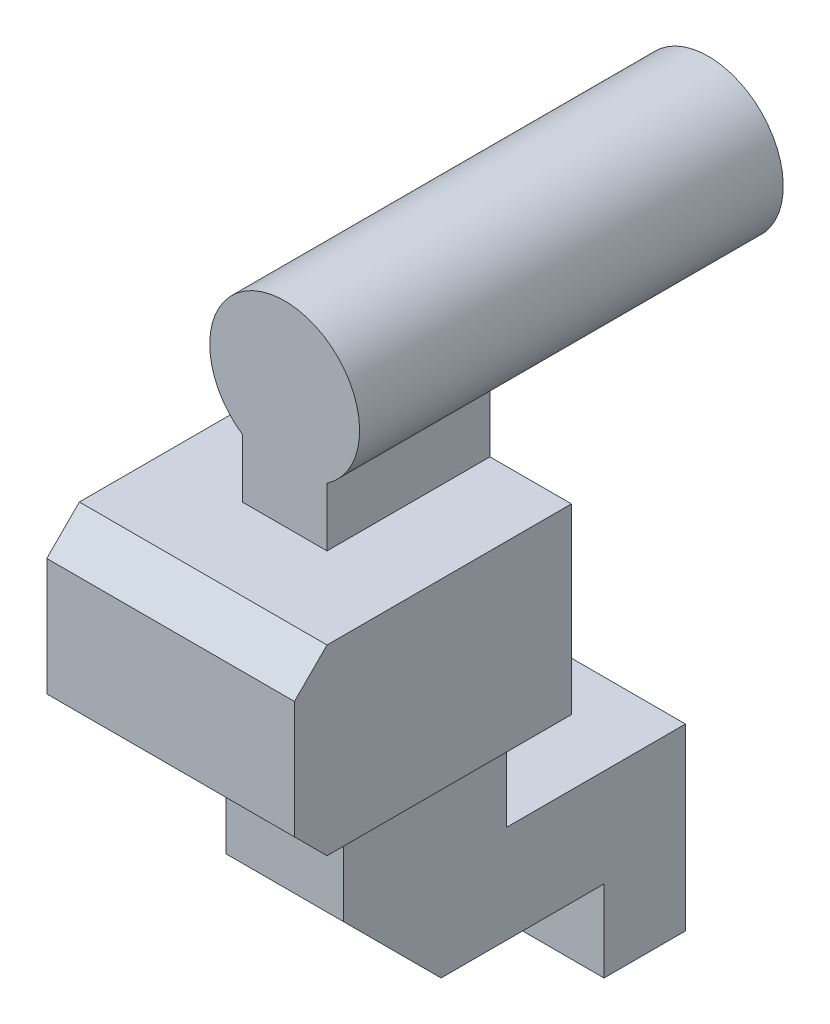
ISO-10303-21;
HEADER;
FILE_DESCRIPTION(('STEP AP214'),'2;1');
FILE_NAME('part.step','',(''),(''),'','','');
FILE_SCHEMA(('AUTOMOTIVE_DESIGN { 1 0 10303 214 1 1 1 1 }'));
ENDSEC;
DATA;
#1=APPLICATION_CONTEXT('core data for automotive mechanical design processes');
#2=APPLICATION_PROTOCOL_DEFINITION('international standard','automotive_design',2000,#1);
#3=PRODUCT_CONTEXT('',#1,'mechanical');
#4=PRODUCT('Part','Part','',(#3));
#5=PRODUCT_RELATED_PRODUCT_CATEGORY('part','',(#4));
#6=PRODUCT_DEFINITION_FORMATION('','',#4);
#7=PRODUCT_DEFINITION_CONTEXT('part definition',#1,'design');
#8=PRODUCT_DEFINITION('design','',#6,#7);
#9=PRODUCT_DEFINITION_SHAPE('','',#8);
#10=(LENGTH_UNIT() NAMED_UNIT(*) SI_UNIT(.MILLI.,.METRE.));
#11=(NAMED_UNIT(*) PLANE_ANGLE_UNIT() SI_UNIT($,.RADIAN.));
#12=(NAMED_UNIT(*) SI_UNIT($,.STERADIAN.) SOLID_ANGLE_UNIT());
#13=UNCERTAINTY_MEASURE_WITH_UNIT(LENGTH_MEASURE(1.E-05),#10,'distance_accuracy_value','');
#14=(GEOMETRIC_REPRESENTATION_CONTEXT(3) GLOBAL_UNCERTAINTY_ASSIGNED_CONTEXT((#13)) GLOBAL_UNIT_ASSIGNED_CONTEXT((#10,
#11,#12)) REPRESENTATION_CONTEXT('',''));
#15=CARTESIAN_POINT('',(0.,0.,0.));
#16=DIRECTION('',(0.,0.,1.));
#17=DIRECTION('',(1.,0.,0.));
#18=AXIS2_PLACEMENT_3D('',#15,#16,#17);
#19=CARTESIAN_POINT('',(0.,0.,5.));
#20=DIRECTION('',(0.,0.,1.));
#21=DIRECTION('',(1.,0.,0.));
#22=AXIS2_PLACEMENT_3D('',#19,#20,#21);
#23=PLANE('',#22);
#24=DIRECTION('',(0.,1.,0.));
#25=VECTOR('',#24,1.);
#26=CARTESIAN_POINT('',(-1.3,0.,5.));
#27=LINE('',#26,#25);
#28=CARTESIAN_POINT('',(-1.3,2.8,5.));
#29=VERTEX_POINT('',#28);
#30=CARTESIAN_POINT('',(-1.3,4.6,5.));
#31=VERTEX_POINT('',#30);
#32=EDGE_CURVE('E248',#29,#31,#27,.T.);
#33=ORIENTED_EDGE('',*,*,#32,.F.);
#34=DIRECTION('',(1.,0.,0.));
#35=VECTOR('',#34,1.);
#36=CARTESIAN_POINT('',(-3.8,2.8,5.));
#37=LINE('',#36,#35);
#38=CARTESIAN_POINT('',(1.3,2.8,5.));
#39=VERTEX_POINT('',#38);
#40=EDGE_CURVE('E306',#29,#39,#37,.T.);
#41=ORIENTED_EDGE('',*,*,#40,.T.);
#42=DIRECTION('',(0.,1.,0.));
#43=VECTOR('',#42,1.);
#44=CARTESIAN_POINT('',(1.3,0.,5.));
#45=LINE('',#44,#43);
#46=CARTESIAN_POINT('',(1.3,4.6,5.));
#47=VERTEX_POINT('',#46);
#48=EDGE_CURVE('E267',#39,#47,#45,.T.);
#49=ORIENTED_EDGE('',*,*,#48,.T.);
#50=CARTESIAN_POINT('',(0.,6.49736659610103,5.));
#51=DIRECTION('',(0.,0.,1.));
#52=DIRECTION('',(1.,0.,0.));
#53=AXIS2_PLACEMENT_3D('',#50,#51,#52);
#54=CIRCLE('',#53,2.3);
#55=EDGE_CURVE('E254',#47,#31,#54,.T.);
#56=ORIENTED_EDGE('',*,*,#55,.T.);
#57=EDGE_LOOP('',(#33,#41,#49,#56));
#58=FACE_BOUND('',#57,.T.);
#59=ADVANCED_FACE('F67',(#58),#23,.T.);
#60=CARTESIAN_POINT('',(0.,0.,0.));
#61=DIRECTION('',(0.,0.,1.));
#62=DIRECTION('',(1.,0.,0.));
#63=AXIS2_PLACEMENT_3D('',#60,#61,#62);
#64=PLANE('',#63);
#65=DIRECTION('',(0.,1.,0.));
#66=VECTOR('',#65,1.);
#67=CARTESIAN_POINT('',(1.8,-9.8,0.));
#68=LINE('',#67,#66);
#69=CARTESIAN_POINT('',(1.8,-6.8,0.));
#70=VERTEX_POINT('',#69);
#71=CARTESIAN_POINT('',(1.8,-2.8,0.));
#72=VERTEX_POINT('',#71);
#73=EDGE_CURVE('E219',#70,#72,#68,.T.);
#74=ORIENTED_EDGE('',*,*,#73,.F.);
#75=DIRECTION('',(-1.,0.,0.));
#76=VECTOR('',#75,1.);
#77=CARTESIAN_POINT('',(1.8,-6.8,0.));
#78=LINE('',#77,#76);
#79=CARTESIAN_POINT('',(-1.8,-6.8,0.));
#80=VERTEX_POINT('',#79);
#81=EDGE_CURVE('E201',#70,#80,#78,.T.);
#82=ORIENTED_EDGE('',*,*,#81,.T.);
#83=DIRECTION('',(0.,-1.,0.));
#84=VECTOR('',#83,1.);
#85=CARTESIAN_POINT('',(-1.8,-2.8,0.));
#86=LINE('',#85,#84);
#87=CARTESIAN_POINT('',(-1.8,-2.8,0.));
#88=VERTEX_POINT('',#87);
#89=EDGE_CURVE('E232',#88,#80,#86,.T.);
#90=ORIENTED_EDGE('',*,*,#89,.F.);
#91=DIRECTION('',(1.,0.,0.));
#92=VECTOR('',#91,1.);
#93=CARTESIAN_POINT('',(-3.8,-2.8,0.));
#94=LINE('',#93,#92);
#95=CARTESIAN_POINT('',(-3.8,-2.8,0.));
#96=VERTEX_POINT('',#95);
#97=EDGE_CURVE('E286',#96,#88,#94,.T.);
#98=ORIENTED_EDGE('',*,*,#97,.F.);
#99=DIRECTION('',(0.,-1.,0.));
#100=VECTOR('',#99,1.);
#101=CARTESIAN_POINT('',(-3.8,2.8,0.));
#102=LINE('',#101,#100);
#103=CARTESIAN_POINT('',(-3.8,2.8,0.));
#104=VERTEX_POINT('',#103);
#105=EDGE_CURVE('E283',#104,#96,#102,.T.);
#106=ORIENTED_EDGE('',*,*,#105,.F.);
#107=DIRECTION('',(-1.,0.,0.));
#108=VECTOR('',#107,1.);
#109=CARTESIAN_POINT('',(-3.8,2.8,0.));
#110=LINE('',#109,#108);
#111=CARTESIAN_POINT('',(-1.3,2.8,0.));
#112=VERTEX_POINT('',#111);
#113=EDGE_CURVE('E279',#112,#104,#110,.T.);
#114=ORIENTED_EDGE('',*,*,#113,.F.);
#115=DIRECTION('',(0.,1.,0.));
#116=VECTOR('',#115,1.);
#117=CARTESIAN_POINT('',(-1.3,0.,0.));
#118=LINE('',#117,#116);
#119=CARTESIAN_POINT('',(-1.3,4.6,0.));
#120=VERTEX_POINT('',#119);
#121=EDGE_CURVE('E263',#112,#120,#118,.T.);
#122=ORIENTED_EDGE('',*,*,#121,.T.);
#123=CARTESIAN_POINT('',(0.,6.49736659610103,0.));
#124=DIRECTION('',(0.,0.,-1.));
#125=DIRECTION('',(-1.,0.,0.));
#126=AXIS2_PLACEMENT_3D('',#123,#124,#125);
#127=CIRCLE('',#126,2.3);
#128=CARTESIAN_POINT('',(1.3,4.6,0.));
#129=VERTEX_POINT('',#128);
#130=EDGE_CURVE('E329',#129,#120,#127,.T.);
#131=ORIENTED_EDGE('',*,*,#130,.F.);
#132=DIRECTION('',(0.,1.,0.));
#133=VECTOR('',#132,1.);
#134=CARTESIAN_POINT('',(1.3,0.,0.));
#135=LINE('',#134,#133);
#136=CARTESIAN_POINT('',(1.3,2.8,0.));
#137=VERTEX_POINT('',#136);
#138=EDGE_CURVE('E266',#137,#129,#135,.T.);
#139=ORIENTED_EDGE('',*,*,#138,.F.);
#140=CARTESIAN_POINT('',(3.8,2.8,0.));
#141=VERTEX_POINT('',#140);
#142=EDGE_CURVE('E280',#141,#137,#110,.T.);
#143=ORIENTED_EDGE('',*,*,#142,.F.);
#144=DIRECTION('',(0.,1.,0.));
#145=VECTOR('',#144,1.);
#146=CARTESIAN_POINT('',(3.8,2.8,0.));
#147=LINE('',#146,#145);
#148=CARTESIAN_POINT('',(3.8,-2.8,0.));
#149=VERTEX_POINT('',#148);
#150=EDGE_CURVE('E261',#149,#141,#147,.T.);
#151=ORIENTED_EDGE('',*,*,#150,.F.);
#152=EDGE_CURVE('E230',#72,#149,#94,.T.);
#153=ORIENTED_EDGE('',*,*,#152,.F.);
#154=EDGE_LOOP('',(#74,#82,#90,#98,#106,#114,#122,#131,#139,#143,#151,#153));
#155=FACE_BOUND('',#154,.T.);
#156=ADVANCED_FACE('F227',(#155),#64,.F.);
#157=CARTESIAN_POINT('',(3.8,2.8,5.));
#158=DIRECTION('',(-1.,0.,0.));
#159=DIRECTION('',(0.,-1.,0.));
#160=AXIS2_PLACEMENT_3D('',#157,#158,#159);
#161=PLANE('',#160);
#162=DIRECTION('',(0.,-1.,0.));
#163=VECTOR('',#162,1.);
#164=CARTESIAN_POINT('',(3.8,2.8,8.5));
#165=LINE('',#164,#163);
#166=CARTESIAN_POINT('',(3.8,1.79999999999999,8.5));
#167=VERTEX_POINT('',#166);
#168=CARTESIAN_POINT('',(3.8,-1.8,8.5));
#169=VERTEX_POINT('',#168);
#170=EDGE_CURVE('E330',#167,#169,#165,.T.);
#171=ORIENTED_EDGE('',*,*,#170,.T.);
#172=DIRECTION('',(0.,-0.707106781186545,-0.70710678118655));
#173=VECTOR('',#172,1.);
#174=CARTESIAN_POINT('',(3.8,-1.8,8.5));
#175=LINE('',#174,#173);
#176=CARTESIAN_POINT('',(3.8,-2.8,7.49999999999999));
#177=VERTEX_POINT('',#176);
#178=EDGE_CURVE('E315',#169,#177,#175,.T.);
#179=ORIENTED_EDGE('',*,*,#178,.T.);
#180=DIRECTION('',(0.,0.,-1.));
#181=VECTOR('',#180,1.);
#182=CARTESIAN_POINT('',(3.8,-2.8,5.));
#183=LINE('',#182,#181);
#184=EDGE_CURVE('E289',#177,#149,#183,.T.);
#185=ORIENTED_EDGE('',*,*,#184,.T.);
#186=ORIENTED_EDGE('',*,*,#150,.T.);
#187=DIRECTION('',(0.,0.,-1.));
#188=VECTOR('',#187,1.);
#189=CARTESIAN_POINT('',(3.8,2.8,5.));
#190=LINE('',#189,#188);
#191=CARTESIAN_POINT('',(3.8,2.8,7.5));
#192=VERTEX_POINT('',#191);
#193=EDGE_CURVE('E295',#192,#141,#190,.T.);
#194=ORIENTED_EDGE('',*,*,#193,.F.);
#195=DIRECTION('',(0.,-0.70710678118655,0.707106781186545));
#196=VECTOR('',#195,1.);
#197=CARTESIAN_POINT('',(3.8,2.8,7.5));
#198=LINE('',#197,#196);
#199=EDGE_CURVE('E313',#192,#167,#198,.T.);
#200=ORIENTED_EDGE('',*,*,#199,.T.);
#201=EDGE_LOOP('',(#171,#179,#185,#186,#194,#200));
#202=FACE_BOUND('',#201,.T.);
#203=ADVANCED_FACE('F334',(#202),#161,.F.);
#204=CARTESIAN_POINT('',(-3.8,2.8,5.));
#205=DIRECTION('',(0.,-1.,0.));
#206=DIRECTION('',(0.,0.,-1.));
#207=AXIS2_PLACEMENT_3D('',#204,#205,#206);
#208=PLANE('',#207);
#209=DIRECTION('',(0.,0.,-1.));
#210=VECTOR('',#209,1.);
#211=CARTESIAN_POINT('',(-3.8,2.8,5.));
#212=LINE('',#211,#210);
#213=CARTESIAN_POINT('',(-3.8,2.8,7.5));
#214=VERTEX_POINT('',#213);
#215=EDGE_CURVE('E293',#214,#104,#212,.T.);
#216=ORIENTED_EDGE('',*,*,#215,.F.);
#217=DIRECTION('',(1.,0.,0.));
#218=VECTOR('',#217,1.);
#219=CARTESIAN_POINT('',(3.8,2.8,7.5));
#220=LINE('',#219,#218);
#221=EDGE_CURVE('E12',#214,#192,#220,.T.);
#222=ORIENTED_EDGE('',*,*,#221,.T.);
#223=ORIENTED_EDGE('',*,*,#193,.T.);
#224=ORIENTED_EDGE('',*,*,#142,.T.);
#225=DIRECTION('',(0.,0.,1.));
#226=VECTOR('',#225,1.);
#227=CARTESIAN_POINT('',(1.3,2.8,0.));
#228=LINE('',#227,#226);
#229=EDGE_CURVE('E258',#137,#39,#228,.T.);
#230=ORIENTED_EDGE('',*,*,#229,.T.);
#231=ORIENTED_EDGE('',*,*,#40,.F.);
#232=DIRECTION('',(0.,0.,1.));
#233=VECTOR('',#232,1.);
#234=CARTESIAN_POINT('',(-1.3,2.8,0.));
#235=LINE('',#234,#233);
#236=EDGE_CURVE('E270',#112,#29,#235,.T.);
#237=ORIENTED_EDGE('',*,*,#236,.F.);
#238=ORIENTED_EDGE('',*,*,#113,.T.);
#239=EDGE_LOOP('',(#216,#222,#223,#224,#230,#231,#237,#238));
#240=FACE_BOUND('',#239,.T.);
#241=ADVANCED_FACE('F341',(#240),#208,.F.);
#242=CARTESIAN_POINT('',(-3.8,2.8,5.));
#243=DIRECTION('',(1.,0.,0.));
#244=DIRECTION('',(0.,1.,0.));
#245=AXIS2_PLACEMENT_3D('',#242,#243,#244);
#246=PLANE('',#245);
#247=DIRECTION('',(0.,0.,-1.));
#248=VECTOR('',#247,1.);
#249=CARTESIAN_POINT('',(-3.8,-2.8,5.));
#250=LINE('',#249,#248);
#251=CARTESIAN_POINT('',(-3.8,-2.8,7.49999999999999));
#252=VERTEX_POINT('',#251);
#253=EDGE_CURVE('E291',#252,#96,#250,.T.);
#254=ORIENTED_EDGE('',*,*,#253,.F.);
#255=DIRECTION('',(0.,0.707106781186545,0.70710678118655));
#256=VECTOR('',#255,1.);
#257=CARTESIAN_POINT('',(-3.8,-1.8,8.5));
#258=LINE('',#257,#256);
#259=CARTESIAN_POINT('',(-3.8,-1.8,8.5));
#260=VERTEX_POINT('',#259);
#261=EDGE_CURVE('E76',#252,#260,#258,.T.);
#262=ORIENTED_EDGE('',*,*,#261,.T.);
#263=DIRECTION('',(0.,-1.,0.));
#264=VECTOR('',#263,1.);
#265=CARTESIAN_POINT('',(-3.8,2.8,8.5));
#266=LINE('',#265,#264);
#267=CARTESIAN_POINT('',(-3.8,1.79999999999999,8.5));
#268=VERTEX_POINT('',#267);
#269=EDGE_CURVE('E321',#268,#260,#266,.T.);
#270=ORIENTED_EDGE('',*,*,#269,.F.);
#271=DIRECTION('',(0.,0.70710678118655,-0.707106781186545));
#272=VECTOR('',#271,1.);
#273=CARTESIAN_POINT('',(-3.8,2.8,7.5));
#274=LINE('',#273,#272);
#275=EDGE_CURVE('E83',#268,#214,#274,.T.);
#276=ORIENTED_EDGE('',*,*,#275,.T.);
#277=ORIENTED_EDGE('',*,*,#215,.T.);
#278=ORIENTED_EDGE('',*,*,#105,.T.);
#279=EDGE_LOOP('',(#254,#262,#270,#276,#277,#278));
#280=FACE_BOUND('',#279,.T.);
#281=ADVANCED_FACE('F320',(#280),#246,.F.);
#282=CARTESIAN_POINT('',(-3.8,-2.8,5.));
#283=DIRECTION('',(0.,1.,0.));
#284=DIRECTION('',(0.,0.,1.));
#285=AXIS2_PLACEMENT_3D('',#282,#283,#284);
#286=PLANE('',#285);
#287=ORIENTED_EDGE('',*,*,#184,.F.);
#288=DIRECTION('',(-1.,0.,0.));
#289=VECTOR('',#288,1.);
#290=CARTESIAN_POINT('',(-3.8,-2.8,7.49999999999999));
#291=LINE('',#290,#289);
#292=EDGE_CURVE('E91',#177,#252,#291,.T.);
#293=ORIENTED_EDGE('',*,*,#292,.T.);
#294=ORIENTED_EDGE('',*,*,#253,.T.);
#295=ORIENTED_EDGE('',*,*,#97,.T.);
#296=DIRECTION('',(0.,0.,1.));
#297=VECTOR('',#296,1.);
#298=CARTESIAN_POINT('',(-1.8,-2.8,0.));
#299=LINE('',#298,#297);
#300=CARTESIAN_POINT('',(-1.8,-2.8,5.));
#301=VERTEX_POINT('',#300);
#302=EDGE_CURVE('E231',#88,#301,#299,.T.);
#303=ORIENTED_EDGE('',*,*,#302,.T.);
#304=DIRECTION('',(1.,0.,0.));
#305=VECTOR('',#304,1.);
#306=CARTESIAN_POINT('',(-3.8,-2.8,5.));
#307=LINE('',#306,#305);
#308=CARTESIAN_POINT('',(1.8,-2.8,5.));
#309=VERTEX_POINT('',#308);
#310=EDGE_CURVE('E310',#301,#309,#307,.T.);
#311=ORIENTED_EDGE('',*,*,#310,.T.);
#312=DIRECTION('',(0.,0.,1.));
#313=VECTOR('',#312,1.);
#314=CARTESIAN_POINT('',(1.8,-2.8,0.));
#315=LINE('',#314,#313);
#316=EDGE_CURVE('E246',#72,#309,#315,.T.);
#317=ORIENTED_EDGE('',*,*,#316,.F.);
#318=ORIENTED_EDGE('',*,*,#152,.T.);
#319=EDGE_LOOP('',(#287,#293,#294,#295,#303,#311,#317,#318));
#320=FACE_BOUND('',#319,.T.);
#321=ADVANCED_FACE('F335',(#320),#286,.F.);
#322=ORIENTED_EDGE('',*,*,#310,.F.);
#323=DIRECTION('',(0.,-1.,0.));
#324=VECTOR('',#323,1.);
#325=CARTESIAN_POINT('',(-1.8,-2.8,5.));
#326=LINE('',#325,#324);
#327=CARTESIAN_POINT('',(-1.8,-6.8,5.));
#328=VERTEX_POINT('',#327);
#329=EDGE_CURVE('E241',#301,#328,#326,.T.);
#330=ORIENTED_EDGE('',*,*,#329,.T.);
#331=DIRECTION('',(1.,0.,0.));
#332=VECTOR('',#331,1.);
#333=CARTESIAN_POINT('',(0.,-6.8,5.));
#334=LINE('',#333,#332);
#335=CARTESIAN_POINT('',(1.8,-6.8,5.));
#336=VERTEX_POINT('',#335);
#337=EDGE_CURVE('E297',#328,#336,#334,.T.);
#338=ORIENTED_EDGE('',*,*,#337,.T.);
#339=DIRECTION('',(0.,1.,0.));
#340=VECTOR('',#339,1.);
#341=CARTESIAN_POINT('',(1.8,-9.8,5.));
#342=LINE('',#341,#340);
#343=EDGE_CURVE('E237',#336,#309,#342,.T.);
#344=ORIENTED_EDGE('',*,*,#343,.T.);
#345=EDGE_LOOP('',(#322,#330,#338,#344));
#346=FACE_BOUND('',#345,.T.);
#347=ADVANCED_FACE('F352',(#346),#23,.T.);
#348=CARTESIAN_POINT('',(0.,6.49736659610103,0.));
#349=DIRECTION('',(0.,0.,1.));
#350=DIRECTION('',(1.,0.,0.));
#351=AXIS2_PLACEMENT_3D('',#348,#349,#350);
#352=CYLINDRICAL_SURFACE('',#351,2.3);
#353=ORIENTED_EDGE('',*,*,#55,.F.);
#354=DIRECTION('',(0.,0.,1.));
#355=VECTOR('',#354,1.);
#356=CARTESIAN_POINT('',(1.3,4.6,0.));
#357=LINE('',#356,#355);
#358=EDGE_CURVE('E257',#129,#47,#357,.T.);
#359=ORIENTED_EDGE('',*,*,#358,.F.);
#360=ORIENTED_EDGE('',*,*,#130,.T.);
#361=DIRECTION('',(0.,0.,1.));
#362=VECTOR('',#361,1.);
#363=CARTESIAN_POINT('',(-1.3,4.6,0.));
#364=LINE('',#363,#362);
#365=EDGE_CURVE('E259',#120,#31,#364,.T.);
#366=ORIENTED_EDGE('',*,*,#365,.T.);
#367=EDGE_LOOP('',(#353,#359,#360,#366));
#368=FACE_BOUND('',#367,.T.);
#369=CARTESIAN_POINT('',(0.,6.49736659610103,-8.));
#370=DIRECTION('',(0.,0.,-1.));
#371=DIRECTION('',(-1.,0.,0.));
#372=AXIS2_PLACEMENT_3D('',#369,#370,#371);
#373=CIRCLE('',#372,2.3);
#374=CARTESIAN_POINT('',(-2.3,6.49736659610103,-8.));
#375=VERTEX_POINT('',#374);
#376=EDGE_CURVE('E244',#375,#375,#373,.T.);
#377=ORIENTED_EDGE('',*,*,#376,.F.);
#378=EDGE_LOOP('',(#377));
#379=FACE_BOUND('',#378,.T.);
#380=ADVANCED_FACE('F361',(#368,#379),#352,.T.);
#381=CARTESIAN_POINT('',(-1.3,0.,0.));
#382=DIRECTION('',(1.,0.,0.));
#383=DIRECTION('',(0.,0.,-1.));
#384=AXIS2_PLACEMENT_3D('',#381,#382,#383);
#385=PLANE('',#384);
#386=ORIENTED_EDGE('',*,*,#32,.T.);
#387=ORIENTED_EDGE('',*,*,#365,.F.);
#388=ORIENTED_EDGE('',*,*,#121,.F.);
#389=ORIENTED_EDGE('',*,*,#236,.T.);
#390=EDGE_LOOP('',(#386,#387,#388,#389));
#391=FACE_BOUND('',#390,.T.);
#392=ADVANCED_FACE('F367',(#391),#385,.F.);
#393=CARTESIAN_POINT('',(1.3,0.,0.));
#394=DIRECTION('',(1.,0.,0.));
#395=DIRECTION('',(0.,0.,-1.));
#396=AXIS2_PLACEMENT_3D('',#393,#394,#395);
#397=PLANE('',#396);
#398=ORIENTED_EDGE('',*,*,#48,.F.);
#399=ORIENTED_EDGE('',*,*,#229,.F.);
#400=ORIENTED_EDGE('',*,*,#138,.T.);
#401=ORIENTED_EDGE('',*,*,#358,.T.);
#402=EDGE_LOOP('',(#398,#399,#400,#401));
#403=FACE_BOUND('',#402,.T.);
#404=ADVANCED_FACE('F415',(#403),#397,.T.);
#405=CARTESIAN_POINT('',(1.8,-9.8,0.));
#406=DIRECTION('',(1.,0.,0.));
#407=DIRECTION('',(0.,0.,-1.));
#408=AXIS2_PLACEMENT_3D('',#405,#406,#407);
#409=PLANE('',#408);
#410=ORIENTED_EDGE('',*,*,#343,.F.);
#411=DIRECTION('',(0.,0.707106781186546,0.707106781186549));
#412=VECTOR('',#411,1.);
#413=CARTESIAN_POINT('',(1.8,-10.8,0.999999999999992));
#414=LINE('',#413,#412);
#415=CARTESIAN_POINT('',(1.8,-9.8,1.99999999999999));
#416=VERTEX_POINT('',#415);
#417=EDGE_CURVE('E300',#336,#416,#414,.F.);
#418=ORIENTED_EDGE('',*,*,#417,.T.);
#419=DIRECTION('',(0.,0.,1.));
#420=VECTOR('',#419,1.);
#421=CARTESIAN_POINT('',(1.8,-9.8,0.));
#422=LINE('',#421,#420);
#423=CARTESIAN_POINT('',(1.8,-9.8,-3.));
#424=VERTEX_POINT('',#423);
#425=EDGE_CURVE('E249',#424,#416,#422,.T.);
#426=ORIENTED_EDGE('',*,*,#425,.F.);
#427=DIRECTION('',(0.,1.,0.));
#428=VECTOR('',#427,1.);
#429=CARTESIAN_POINT('',(1.8,-9.8,-3.));
#430=LINE('',#429,#428);
#431=CARTESIAN_POINT('',(1.8,-12.3,-3.));
#432=VERTEX_POINT('',#431);
#433=EDGE_CURVE('E212',#432,#424,#430,.T.);
#434=ORIENTED_EDGE('',*,*,#433,.F.);
#435=DIRECTION('',(0.,0.,1.));
#436=VECTOR('',#435,1.);
#437=CARTESIAN_POINT('',(1.8,-12.3,-3.));
#438=LINE('',#437,#436);
#439=CARTESIAN_POINT('',(1.8,-12.3,-5.5));
#440=VERTEX_POINT('',#439);
#441=EDGE_CURVE('E457',#440,#432,#438,.T.);
#442=ORIENTED_EDGE('',*,*,#441,.F.);
#443=DIRECTION('',(0.,-1.,0.));
#444=VECTOR('',#443,1.);
#445=CARTESIAN_POINT('',(1.8,-12.3,-5.5));
#446=LINE('',#445,#444);
#447=CARTESIAN_POINT('',(1.8,-6.8,-5.5));
#448=VERTEX_POINT('',#447);
#449=EDGE_CURVE('E223',#448,#440,#446,.T.);
#450=ORIENTED_EDGE('',*,*,#449,.F.);
#451=DIRECTION('',(0.,0.,-1.));
#452=VECTOR('',#451,1.);
#453=CARTESIAN_POINT('',(1.8,-6.8,-5.5));
#454=LINE('',#453,#452);
#455=EDGE_CURVE('E204',#70,#448,#454,.T.);
#456=ORIENTED_EDGE('',*,*,#455,.F.);
#457=ORIENTED_EDGE('',*,*,#73,.T.);
#458=ORIENTED_EDGE('',*,*,#316,.T.);
#459=EDGE_LOOP('',(#410,#418,#426,#434,#442,#450,#456,#457,#458));
#460=FACE_BOUND('',#459,.T.);
#461=ADVANCED_FACE('F217',(#460),#409,.T.);
#462=CARTESIAN_POINT('',(-1.8,-9.8,0.));
#463=DIRECTION('',(0.,-1.,0.));
#464=DIRECTION('',(0.,0.,-1.));
#465=AXIS2_PLACEMENT_3D('',#462,#463,#464);
#466=PLANE('',#465);
#467=ORIENTED_EDGE('',*,*,#425,.T.);
#468=DIRECTION('',(-1.,0.,0.));
#469=VECTOR('',#468,1.);
#470=CARTESIAN_POINT('',(-1.8,-9.8,1.99999999999999));
#471=LINE('',#470,#469);
#472=CARTESIAN_POINT('',(-1.8,-9.8,1.99999999999999));
#473=VERTEX_POINT('',#472);
#474=EDGE_CURVE('E302',#416,#473,#471,.T.);
#475=ORIENTED_EDGE('',*,*,#474,.T.);
#476=DIRECTION('',(0.,0.,1.));
#477=VECTOR('',#476,1.);
#478=CARTESIAN_POINT('',(-1.8,-9.8,0.));
#479=LINE('',#478,#477);
#480=CARTESIAN_POINT('',(-1.8,-9.8,-3.));
#481=VERTEX_POINT('',#480);
#482=EDGE_CURVE('E235',#481,#473,#479,.T.);
#483=ORIENTED_EDGE('',*,*,#482,.F.);
#484=DIRECTION('',(-1.,0.,0.));
#485=VECTOR('',#484,1.);
#486=CARTESIAN_POINT('',(1.8,-9.8,-3.));
#487=LINE('',#486,#485);
#488=EDGE_CURVE('E394',#424,#481,#487,.T.);
#489=ORIENTED_EDGE('',*,*,#488,.F.);
#490=EDGE_LOOP('',(#467,#475,#483,#489));
#491=FACE_BOUND('',#490,.T.);
#492=ADVANCED_FACE('F422',(#491),#466,.T.);
#493=CARTESIAN_POINT('',(-1.8,-2.8,0.));
#494=DIRECTION('',(-1.,0.,0.));
#495=DIRECTION('',(0.,-1.,0.));
#496=AXIS2_PLACEMENT_3D('',#493,#494,#495);
#497=PLANE('',#496);
#498=ORIENTED_EDGE('',*,*,#482,.T.);
#499=DIRECTION('',(0.,-0.707106781186546,-0.707106781186549));
#500=VECTOR('',#499,1.);
#501=CARTESIAN_POINT('',(-1.8,-7.30000000000001,4.49999999999999));
#502=LINE('',#501,#500);
#503=EDGE_CURVE('E304',#473,#328,#502,.F.);
#504=ORIENTED_EDGE('',*,*,#503,.T.);
#505=ORIENTED_EDGE('',*,*,#329,.F.);
#506=ORIENTED_EDGE('',*,*,#302,.F.);
#507=ORIENTED_EDGE('',*,*,#89,.T.);
#508=DIRECTION('',(0.,0.,-1.));
#509=VECTOR('',#508,1.);
#510=CARTESIAN_POINT('',(-1.8,-6.8,-5.5));
#511=LINE('',#510,#509);
#512=CARTESIAN_POINT('',(-1.8,-6.8,-5.5));
#513=VERTEX_POINT('',#512);
#514=EDGE_CURVE('E206',#80,#513,#511,.T.);
#515=ORIENTED_EDGE('',*,*,#514,.T.);
#516=DIRECTION('',(0.,-1.,0.));
#517=VECTOR('',#516,1.);
#518=CARTESIAN_POINT('',(-1.8,-12.3,-5.5));
#519=LINE('',#518,#517);
#520=CARTESIAN_POINT('',(-1.8,-12.3,-5.5));
#521=VERTEX_POINT('',#520);
#522=EDGE_CURVE('E384',#513,#521,#519,.T.);
#523=ORIENTED_EDGE('',*,*,#522,.T.);
#524=DIRECTION('',(0.,0.,1.));
#525=VECTOR('',#524,1.);
#526=CARTESIAN_POINT('',(-1.8,-12.3,-3.));
#527=LINE('',#526,#525);
#528=CARTESIAN_POINT('',(-1.8,-12.3,-3.));
#529=VERTEX_POINT('',#528);
#530=EDGE_CURVE('E386',#521,#529,#527,.T.);
#531=ORIENTED_EDGE('',*,*,#530,.T.);
#532=DIRECTION('',(0.,1.,0.));
#533=VECTOR('',#532,1.);
#534=CARTESIAN_POINT('',(-1.8,-9.8,-3.));
#535=LINE('',#534,#533);
#536=EDGE_CURVE('E224',#529,#481,#535,.T.);
#537=ORIENTED_EDGE('',*,*,#536,.T.);
#538=EDGE_LOOP('',(#498,#504,#505,#506,#507,#515,#523,#531,#537));
#539=FACE_BOUND('',#538,.T.);
#540=ADVANCED_FACE('F376',(#539),#497,.T.);
#541=CARTESIAN_POINT('',(0.,6.49736659610103,-8.));
#542=DIRECTION('',(0.,0.,-1.));
#543=DIRECTION('',(-1.,0.,0.));
#544=AXIS2_PLACEMENT_3D('',#541,#542,#543);
#545=PLANE('',#544);
#546=ORIENTED_EDGE('',*,*,#376,.T.);
#547=EDGE_LOOP('',(#546));
#548=FACE_BOUND('',#547,.T.);
#549=ADVANCED_FACE('F427',(#548),#545,.T.);
#550=CARTESIAN_POINT('',(0.,-6.8,5.));
#551=DIRECTION('',(0.,0.707106781186549,-0.707106781186546));
#552=DIRECTION('',(1.,0.,0.));
#553=AXIS2_PLACEMENT_3D('',#550,#551,#552);
#554=PLANE('',#553);
#555=ORIENTED_EDGE('',*,*,#503,.F.);
#556=ORIENTED_EDGE('',*,*,#474,.F.);
#557=ORIENTED_EDGE('',*,*,#417,.F.);
#558=ORIENTED_EDGE('',*,*,#337,.F.);
#559=EDGE_LOOP('',(#555,#556,#557,#558));
#560=FACE_BOUND('',#559,.T.);
#561=ADVANCED_FACE('F432',(#560),#554,.F.);
#562=CARTESIAN_POINT('',(-3.8,2.8,8.5));
#563=DIRECTION('',(0.,0.,1.));
#564=DIRECTION('',(1.,0.,0.));
#565=AXIS2_PLACEMENT_3D('',#562,#563,#564);
#566=PLANE('',#565);
#567=ORIENTED_EDGE('',*,*,#269,.T.);
#568=DIRECTION('',(1.,0.,0.));
#569=VECTOR('',#568,1.);
#570=CARTESIAN_POINT('',(3.8,-1.8,8.5));
#571=LINE('',#570,#569);
#572=EDGE_CURVE('E309',#260,#169,#571,.T.);
#573=ORIENTED_EDGE('',*,*,#572,.T.);
#574=ORIENTED_EDGE('',*,*,#170,.F.);
#575=DIRECTION('',(-1.,0.,0.));
#576=VECTOR('',#575,1.);
#577=CARTESIAN_POINT('',(-3.8,1.79999999999999,8.5));
#578=LINE('',#577,#576);
#579=EDGE_CURVE('E307',#167,#268,#578,.T.);
#580=ORIENTED_EDGE('',*,*,#579,.T.);
#581=EDGE_LOOP('',(#567,#573,#574,#580));
#582=FACE_BOUND('',#581,.T.);
#583=ADVANCED_FACE('F325',(#582),#566,.T.);
#584=CARTESIAN_POINT('',(1.8,-9.8,-3.));
#585=DIRECTION('',(0.,0.,1.));
#586=DIRECTION('',(1.,0.,0.));
#587=AXIS2_PLACEMENT_3D('',#584,#585,#586);
#588=PLANE('',#587);
#589=ORIENTED_EDGE('',*,*,#536,.F.);
#590=DIRECTION('',(-1.,0.,0.));
#591=VECTOR('',#590,1.);
#592=CARTESIAN_POINT('',(1.8,-12.3,-3.));
#593=LINE('',#592,#591);
#594=EDGE_CURVE('E397',#432,#529,#593,.T.);
#595=ORIENTED_EDGE('',*,*,#594,.F.);
#596=ORIENTED_EDGE('',*,*,#433,.T.);
#597=ORIENTED_EDGE('',*,*,#488,.T.);
#598=EDGE_LOOP('',(#589,#595,#596,#597));
#599=FACE_BOUND('',#598,.T.);
#600=ADVANCED_FACE('F436',(#599),#588,.T.);
#601=CARTESIAN_POINT('',(1.8,-12.3,-3.));
#602=DIRECTION('',(0.,-1.,0.));
#603=DIRECTION('',(0.,0.,-1.));
#604=AXIS2_PLACEMENT_3D('',#601,#602,#603);
#605=PLANE('',#604);
#606=ORIENTED_EDGE('',*,*,#530,.F.);
#607=DIRECTION('',(-1.,0.,0.));
#608=VECTOR('',#607,1.);
#609=CARTESIAN_POINT('',(1.8,-12.3,-5.5));
#610=LINE('',#609,#608);
#611=EDGE_CURVE('E399',#440,#521,#610,.T.);
#612=ORIENTED_EDGE('',*,*,#611,.F.);
#613=ORIENTED_EDGE('',*,*,#441,.T.);
#614=ORIENTED_EDGE('',*,*,#594,.T.);
#615=EDGE_LOOP('',(#606,#612,#613,#614));
#616=FACE_BOUND('',#615,.T.);
#617=ADVANCED_FACE('F442',(#616),#605,.T.);
#618=CARTESIAN_POINT('',(1.8,-12.3,-5.5));
#619=DIRECTION('',(0.,0.,-1.));
#620=DIRECTION('',(0.,1.,0.));
#621=AXIS2_PLACEMENT_3D('',#618,#619,#620);
#622=PLANE('',#621);
#623=ORIENTED_EDGE('',*,*,#522,.F.);
#624=DIRECTION('',(-1.,0.,0.));
#625=VECTOR('',#624,1.);
#626=CARTESIAN_POINT('',(1.8,-6.8,-5.5));
#627=LINE('',#626,#625);
#628=EDGE_CURVE('E211',#448,#513,#627,.T.);
#629=ORIENTED_EDGE('',*,*,#628,.F.);
#630=ORIENTED_EDGE('',*,*,#449,.T.);
#631=ORIENTED_EDGE('',*,*,#611,.T.);
#632=EDGE_LOOP('',(#623,#629,#630,#631));
#633=FACE_BOUND('',#632,.T.);
#634=ADVANCED_FACE('F439',(#633),#622,.T.);
#635=CARTESIAN_POINT('',(1.8,-6.8,-5.5));
#636=DIRECTION('',(0.,1.,0.));
#637=DIRECTION('',(-1.,0.,0.));
#638=AXIS2_PLACEMENT_3D('',#635,#636,#637);
#639=PLANE('',#638);
#640=ORIENTED_EDGE('',*,*,#514,.F.);
#641=ORIENTED_EDGE('',*,*,#81,.F.);
#642=ORIENTED_EDGE('',*,*,#455,.T.);
#643=ORIENTED_EDGE('',*,*,#628,.T.);
#644=EDGE_LOOP('',(#640,#641,#642,#643));
#645=FACE_BOUND('',#644,.T.);
#646=ADVANCED_FACE('F203',(#645),#639,.T.);
#647=CARTESIAN_POINT('',(-3.8,-1.8,8.5));
#648=DIRECTION('',(0.,-0.70710678118655,0.707106781186545));
#649=DIRECTION('',(-1.,0.,0.));
#650=AXIS2_PLACEMENT_3D('',#647,#648,#649);
#651=PLANE('',#650);
#652=ORIENTED_EDGE('',*,*,#261,.F.);
#653=ORIENTED_EDGE('',*,*,#292,.F.);
#654=ORIENTED_EDGE('',*,*,#178,.F.);
#655=ORIENTED_EDGE('',*,*,#572,.F.);
#656=EDGE_LOOP('',(#652,#653,#654,#655));
#657=FACE_BOUND('',#656,.T.);
#658=ADVANCED_FACE('F332',(#657),#651,.T.);
#659=CARTESIAN_POINT('',(-3.8,2.8,7.5));
#660=DIRECTION('',(0.,0.707106781186545,0.70710678118655));
#661=DIRECTION('',(-1.,0.,0.));
#662=AXIS2_PLACEMENT_3D('',#659,#660,#661);
#663=PLANE('',#662);
#664=ORIENTED_EDGE('',*,*,#275,.F.);
#665=ORIENTED_EDGE('',*,*,#579,.F.);
#666=ORIENTED_EDGE('',*,*,#199,.F.);
#667=ORIENTED_EDGE('',*,*,#221,.F.);
#668=EDGE_LOOP('',(#664,#665,#666,#667));
#669=FACE_BOUND('',#668,.T.);
#670=ADVANCED_FACE('F70',(#669),#663,.T.);
#671=CLOSED_SHELL('',(#59,#156,#203,#241,#281,#321,#347,#380,#392,#404,#461,#492,#540,#549,#561,
#583,#600,#617,#634,#646,#658,#670));
#672=MANIFOLD_SOLID_BREP('B2',#671);
#673=ADVANCED_BREP_SHAPE_REPRESENTATION('',(#18,#672),#14);
#674=SHAPE_DEFINITION_REPRESENTATION(#9,#673);
ENDSEC;
END-ISO-10303-21;
